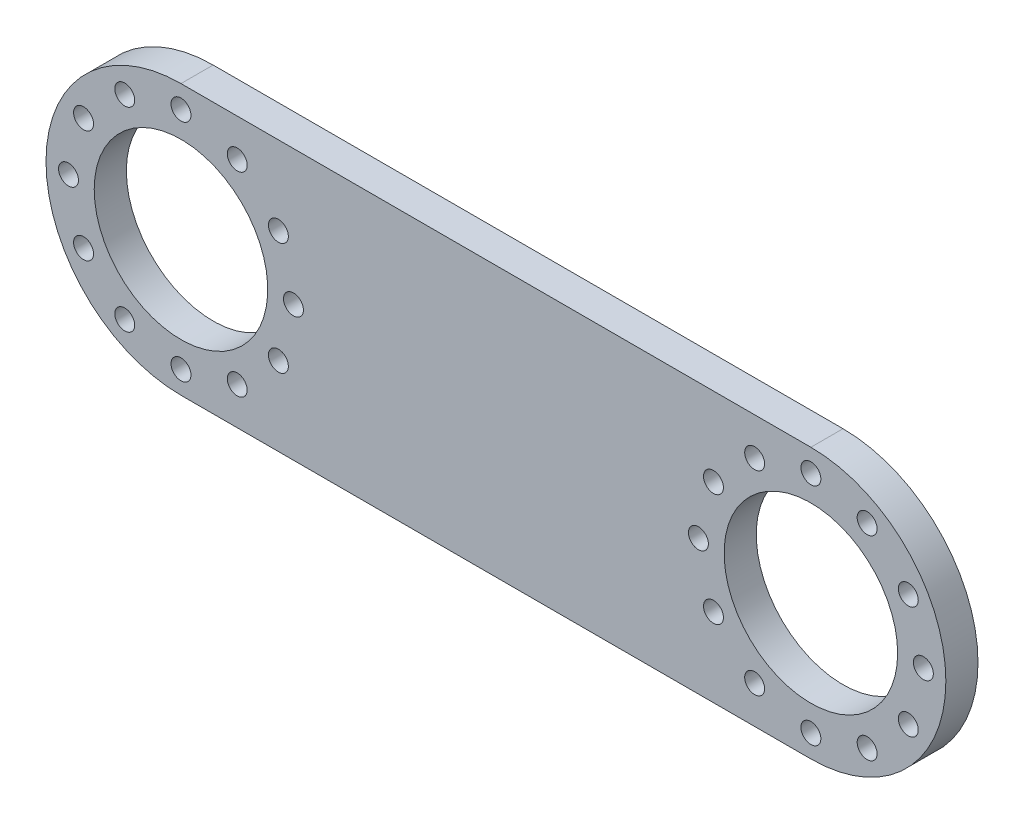
ISO-10303-21;
HEADER;
FILE_DESCRIPTION(('STEP AP214'),'2;1');
FILE_NAME('part.step','',(''),(''),'','','');
FILE_SCHEMA(('AUTOMOTIVE_DESIGN { 1 0 10303 214 1 1 1 1 }'));
ENDSEC;
DATA;
#1=APPLICATION_CONTEXT('core data for automotive mechanical design processes');
#2=APPLICATION_PROTOCOL_DEFINITION('international standard','automotive_design',2000,#1);
#3=PRODUCT_CONTEXT('',#1,'mechanical');
#4=PRODUCT('Part','Part','',(#3));
#5=PRODUCT_RELATED_PRODUCT_CATEGORY('part','',(#4));
#6=PRODUCT_DEFINITION_FORMATION('','',#4);
#7=PRODUCT_DEFINITION_CONTEXT('part definition',#1,'design');
#8=PRODUCT_DEFINITION('design','',#6,#7);
#9=PRODUCT_DEFINITION_SHAPE('','',#8);
#10=(LENGTH_UNIT() NAMED_UNIT(*) SI_UNIT(.MILLI.,.METRE.));
#11=(NAMED_UNIT(*) PLANE_ANGLE_UNIT() SI_UNIT($,.RADIAN.));
#12=(NAMED_UNIT(*) SI_UNIT($,.STERADIAN.) SOLID_ANGLE_UNIT());
#13=UNCERTAINTY_MEASURE_WITH_UNIT(LENGTH_MEASURE(1.E-05),#10,'distance_accuracy_value','');
#14=(GEOMETRIC_REPRESENTATION_CONTEXT(3) GLOBAL_UNCERTAINTY_ASSIGNED_CONTEXT((#13)) GLOBAL_UNIT_ASSIGNED_CONTEXT((#10,
#11,#12)) REPRESENTATION_CONTEXT('',''));
#15=CARTESIAN_POINT('',(0.,0.,0.));
#16=DIRECTION('',(0.,0.,1.));
#17=DIRECTION('',(1.,0.,0.));
#18=AXIS2_PLACEMENT_3D('',#15,#16,#17);
#19=CARTESIAN_POINT('',(-49.,0.,5.));
#20=DIRECTION('',(0.,0.,-1.));
#21=DIRECTION('',(-1.,0.,0.));
#22=AXIS2_PLACEMENT_3D('',#19,#20,#21);
#23=CYLINDRICAL_SURFACE('',#22,21.);
#24=CARTESIAN_POINT('',(-49.,0.,0.));
#25=DIRECTION('',(0.,0.,1.));
#26=DIRECTION('',(1.,0.,0.));
#27=AXIS2_PLACEMENT_3D('',#24,#25,#26);
#28=CIRCLE('',#27,21.);
#29=CARTESIAN_POINT('',(-49.,21.,0.));
#30=VERTEX_POINT('',#29);
#31=CARTESIAN_POINT('',(-49.,-21.,0.));
#32=VERTEX_POINT('',#31);
#33=EDGE_CURVE('E98',#30,#32,#28,.T.);
#34=ORIENTED_EDGE('',*,*,#33,.T.);
#35=DIRECTION('',(0.,0.,-1.));
#36=VECTOR('',#35,1.);
#37=CARTESIAN_POINT('',(-49.,-21.,5.));
#38=LINE('',#37,#36);
#39=CARTESIAN_POINT('',(-49.,-21.,5.));
#40=VERTEX_POINT('',#39);
#41=EDGE_CURVE('E11',#40,#32,#38,.T.);
#42=ORIENTED_EDGE('',*,*,#41,.F.);
#43=CARTESIAN_POINT('',(-49.,0.,5.));
#44=DIRECTION('',(0.,0.,1.));
#45=DIRECTION('',(1.,0.,0.));
#46=AXIS2_PLACEMENT_3D('',#43,#44,#45);
#47=CIRCLE('',#46,21.);
#48=CARTESIAN_POINT('',(-49.,21.,5.));
#49=VERTEX_POINT('',#48);
#50=EDGE_CURVE('E86',#49,#40,#47,.T.);
#51=ORIENTED_EDGE('',*,*,#50,.F.);
#52=DIRECTION('',(0.,0.,-1.));
#53=VECTOR('',#52,1.);
#54=CARTESIAN_POINT('',(-49.,21.,5.));
#55=LINE('',#54,#53);
#56=EDGE_CURVE('E94',#49,#30,#55,.T.);
#57=ORIENTED_EDGE('',*,*,#56,.T.);
#58=EDGE_LOOP('',(#34,#42,#51,#57));
#59=FACE_BOUND('',#58,.T.);
#60=ADVANCED_FACE('F35',(#59),#23,.T.);
#61=CARTESIAN_POINT('',(-49.,-21.,5.));
#62=DIRECTION('',(0.,1.,0.));
#63=DIRECTION('',(-1.,0.,0.));
#64=AXIS2_PLACEMENT_3D('',#61,#62,#63);
#65=PLANE('',#64);
#66=DIRECTION('',(1.,0.,0.));
#67=VECTOR('',#66,1.);
#68=CARTESIAN_POINT('',(-49.,-21.,0.));
#69=LINE('',#68,#67);
#70=CARTESIAN_POINT('',(49.,-21.,0.));
#71=VERTEX_POINT('',#70);
#72=EDGE_CURVE('E90',#32,#71,#69,.T.);
#73=ORIENTED_EDGE('',*,*,#72,.T.);
#74=DIRECTION('',(0.,0.,-1.));
#75=VECTOR('',#74,1.);
#76=CARTESIAN_POINT('',(49.,-21.,5.));
#77=LINE('',#76,#75);
#78=CARTESIAN_POINT('',(49.,-21.,5.));
#79=VERTEX_POINT('',#78);
#80=EDGE_CURVE('E43',#79,#71,#77,.T.);
#81=ORIENTED_EDGE('',*,*,#80,.F.);
#82=DIRECTION('',(1.,0.,0.));
#83=VECTOR('',#82,1.);
#84=CARTESIAN_POINT('',(-49.,-21.,5.));
#85=LINE('',#84,#83);
#86=EDGE_CURVE('E81',#40,#79,#85,.T.);
#87=ORIENTED_EDGE('',*,*,#86,.F.);
#88=ORIENTED_EDGE('',*,*,#41,.T.);
#89=EDGE_LOOP('',(#73,#81,#87,#88));
#90=FACE_BOUND('',#89,.T.);
#91=ADVANCED_FACE('F89',(#90),#65,.F.);
#92=CARTESIAN_POINT('',(49.,0.,5.));
#93=DIRECTION('',(0.,0.,-1.));
#94=DIRECTION('',(-1.,0.,0.));
#95=AXIS2_PLACEMENT_3D('',#92,#93,#94);
#96=CYLINDRICAL_SURFACE('',#95,21.);
#97=CARTESIAN_POINT('',(49.,0.,0.));
#98=DIRECTION('',(0.,0.,1.));
#99=DIRECTION('',(1.,0.,0.));
#100=AXIS2_PLACEMENT_3D('',#97,#98,#99);
#101=CIRCLE('',#100,21.);
#102=CARTESIAN_POINT('',(49.,21.,0.));
#103=VERTEX_POINT('',#102);
#104=EDGE_CURVE('E68',#71,#103,#101,.T.);
#105=ORIENTED_EDGE('',*,*,#104,.T.);
#106=DIRECTION('',(0.,0.,-1.));
#107=VECTOR('',#106,1.);
#108=CARTESIAN_POINT('',(49.,21.,5.));
#109=LINE('',#108,#107);
#110=CARTESIAN_POINT('',(49.,21.,5.));
#111=VERTEX_POINT('',#110);
#112=EDGE_CURVE('E91',#111,#103,#109,.T.);
#113=ORIENTED_EDGE('',*,*,#112,.F.);
#114=CARTESIAN_POINT('',(49.,0.,5.));
#115=DIRECTION('',(0.,0.,1.));
#116=DIRECTION('',(1.,0.,0.));
#117=AXIS2_PLACEMENT_3D('',#114,#115,#116);
#118=CIRCLE('',#117,21.);
#119=EDGE_CURVE('E84',#79,#111,#118,.T.);
#120=ORIENTED_EDGE('',*,*,#119,.F.);
#121=ORIENTED_EDGE('',*,*,#80,.T.);
#122=EDGE_LOOP('',(#105,#113,#120,#121));
#123=FACE_BOUND('',#122,.T.);
#124=ADVANCED_FACE('F92',(#123),#96,.T.);
#125=CARTESIAN_POINT('',(-49.,21.,5.));
#126=DIRECTION('',(0.,-1.,0.));
#127=DIRECTION('',(1.,0.,0.));
#128=AXIS2_PLACEMENT_3D('',#125,#126,#127);
#129=PLANE('',#128);
#130=DIRECTION('',(-1.,0.,0.));
#131=VECTOR('',#130,1.);
#132=CARTESIAN_POINT('',(-49.,21.,0.));
#133=LINE('',#132,#131);
#134=EDGE_CURVE('E74',#103,#30,#133,.T.);
#135=ORIENTED_EDGE('',*,*,#134,.T.);
#136=ORIENTED_EDGE('',*,*,#56,.F.);
#137=DIRECTION('',(-1.,0.,0.));
#138=VECTOR('',#137,1.);
#139=CARTESIAN_POINT('',(-49.,21.,5.));
#140=LINE('',#139,#138);
#141=EDGE_CURVE('E51',#111,#49,#140,.T.);
#142=ORIENTED_EDGE('',*,*,#141,.F.);
#143=ORIENTED_EDGE('',*,*,#112,.T.);
#144=EDGE_LOOP('',(#135,#136,#142,#143));
#145=FACE_BOUND('',#144,.T.);
#146=ADVANCED_FACE('F106',(#145),#129,.F.);
#147=CARTESIAN_POINT('',(-49.,0.,5.));
#148=DIRECTION('',(0.,0.,1.));
#149=DIRECTION('',(1.,0.,0.));
#150=AXIS2_PLACEMENT_3D('',#147,#148,#149);
#151=PLANE('',#150);
#152=CARTESIAN_POINT('',(-49.,17.5,5.));
#153=DIRECTION('',(0.,0.,-1.));
#154=DIRECTION('',(-1.,0.,0.));
#155=AXIS2_PLACEMENT_3D('',#152,#153,#154);
#156=CIRCLE('',#155,1.55);
#157=CARTESIAN_POINT('',(-50.55,17.5,5.));
#158=VERTEX_POINT('',#157);
#159=EDGE_CURVE('E239',#158,#158,#156,.T.);
#160=ORIENTED_EDGE('',*,*,#159,.T.);
#161=EDGE_LOOP('',(#160));
#162=FACE_BOUND('',#161,.T.);
#163=CARTESIAN_POINT('',(-57.75,15.1554445662277,5.));
#164=DIRECTION('',(0.,0.,-1.));
#165=DIRECTION('',(-1.,0.,0.));
#166=AXIS2_PLACEMENT_3D('',#163,#164,#165);
#167=CIRCLE('',#166,1.54999999999999);
#168=CARTESIAN_POINT('',(-59.3,15.1554445662277,5.));
#169=VERTEX_POINT('',#168);
#170=EDGE_CURVE('E233',#169,#169,#167,.T.);
#171=ORIENTED_EDGE('',*,*,#170,.T.);
#172=EDGE_LOOP('',(#171));
#173=FACE_BOUND('',#172,.T.);
#174=CARTESIAN_POINT('',(-64.1554445662277,8.75000000000001,5.));
#175=DIRECTION('',(0.,0.,-1.));
#176=DIRECTION('',(-1.,0.,0.));
#177=AXIS2_PLACEMENT_3D('',#174,#175,#176);
#178=CIRCLE('',#177,1.55000000000001);
#179=CARTESIAN_POINT('',(-65.7054445662277,8.75000000000001,5.));
#180=VERTEX_POINT('',#179);
#181=EDGE_CURVE('E227',#180,#180,#178,.T.);
#182=ORIENTED_EDGE('',*,*,#181,.T.);
#183=EDGE_LOOP('',(#182));
#184=FACE_BOUND('',#183,.T.);
#185=CARTESIAN_POINT('',(-66.5,0.,5.));
#186=DIRECTION('',(0.,0.,-1.));
#187=DIRECTION('',(-1.,0.,0.));
#188=AXIS2_PLACEMENT_3D('',#185,#186,#187);
#189=CIRCLE('',#188,1.54999999999999);
#190=CARTESIAN_POINT('',(-68.05,0.,5.));
#191=VERTEX_POINT('',#190);
#192=EDGE_CURVE('E221',#191,#191,#189,.T.);
#193=ORIENTED_EDGE('',*,*,#192,.T.);
#194=EDGE_LOOP('',(#193));
#195=FACE_BOUND('',#194,.T.);
#196=CARTESIAN_POINT('',(-64.1554445662277,-8.75,5.));
#197=DIRECTION('',(0.,0.,-1.));
#198=DIRECTION('',(-1.,0.,0.));
#199=AXIS2_PLACEMENT_3D('',#196,#197,#198);
#200=CIRCLE('',#199,1.54999999999999);
#201=CARTESIAN_POINT('',(-65.7054445662277,-8.75,5.));
#202=VERTEX_POINT('',#201);
#203=EDGE_CURVE('E215',#202,#202,#200,.T.);
#204=ORIENTED_EDGE('',*,*,#203,.T.);
#205=EDGE_LOOP('',(#204));
#206=FACE_BOUND('',#205,.T.);
#207=CARTESIAN_POINT('',(-57.75,-15.1554445662277,5.));
#208=DIRECTION('',(0.,0.,-1.));
#209=DIRECTION('',(-1.,0.,0.));
#210=AXIS2_PLACEMENT_3D('',#207,#208,#209);
#211=CIRCLE('',#210,1.54999999999999);
#212=CARTESIAN_POINT('',(-59.3,-15.1554445662277,5.));
#213=VERTEX_POINT('',#212);
#214=EDGE_CURVE('E209',#213,#213,#211,.T.);
#215=ORIENTED_EDGE('',*,*,#214,.T.);
#216=EDGE_LOOP('',(#215));
#217=FACE_BOUND('',#216,.T.);
#218=CARTESIAN_POINT('',(-49.,-17.5,5.));
#219=DIRECTION('',(0.,0.,-1.));
#220=DIRECTION('',(-1.,0.,0.));
#221=AXIS2_PLACEMENT_3D('',#218,#219,#220);
#222=CIRCLE('',#221,1.54999999999999);
#223=CARTESIAN_POINT('',(-50.55,-17.5,5.));
#224=VERTEX_POINT('',#223);
#225=EDGE_CURVE('E203',#224,#224,#222,.T.);
#226=ORIENTED_EDGE('',*,*,#225,.T.);
#227=EDGE_LOOP('',(#226));
#228=FACE_BOUND('',#227,.T.);
#229=CARTESIAN_POINT('',(-40.25,-15.1554445662277,5.));
#230=DIRECTION('',(0.,0.,-1.));
#231=DIRECTION('',(-1.,0.,0.));
#232=AXIS2_PLACEMENT_3D('',#229,#230,#231);
#233=CIRCLE('',#232,1.55000000000001);
#234=CARTESIAN_POINT('',(-41.8,-15.1554445662277,5.));
#235=VERTEX_POINT('',#234);
#236=EDGE_CURVE('E196',#235,#235,#233,.T.);
#237=ORIENTED_EDGE('',*,*,#236,.T.);
#238=EDGE_LOOP('',(#237));
#239=FACE_BOUND('',#238,.T.);
#240=CARTESIAN_POINT('',(-33.8445554337723,-8.75000000000001,5.));
#241=DIRECTION('',(0.,0.,-1.));
#242=DIRECTION('',(-1.,0.,0.));
#243=AXIS2_PLACEMENT_3D('',#240,#241,#242);
#244=CIRCLE('',#243,1.55);
#245=CARTESIAN_POINT('',(-35.3945554337723,-8.75000000000001,5.));
#246=VERTEX_POINT('',#245);
#247=EDGE_CURVE('E262',#246,#246,#244,.T.);
#248=ORIENTED_EDGE('',*,*,#247,.T.);
#249=EDGE_LOOP('',(#248));
#250=FACE_BOUND('',#249,.T.);
#251=CARTESIAN_POINT('',(-31.5,0.,5.));
#252=DIRECTION('',(0.,0.,-1.));
#253=DIRECTION('',(-1.,0.,0.));
#254=AXIS2_PLACEMENT_3D('',#251,#252,#253);
#255=CIRCLE('',#254,1.55);
#256=CARTESIAN_POINT('',(-33.05,0.,5.));
#257=VERTEX_POINT('',#256);
#258=EDGE_CURVE('E256',#257,#257,#255,.T.);
#259=ORIENTED_EDGE('',*,*,#258,.T.);
#260=EDGE_LOOP('',(#259));
#261=FACE_BOUND('',#260,.T.);
#262=CARTESIAN_POINT('',(-33.8445554337723,8.74999999999999,5.));
#263=DIRECTION('',(0.,0.,-1.));
#264=DIRECTION('',(-1.,0.,0.));
#265=AXIS2_PLACEMENT_3D('',#262,#263,#264);
#266=CIRCLE('',#265,1.55);
#267=CARTESIAN_POINT('',(-35.3945554337723,8.74999999999999,5.));
#268=VERTEX_POINT('',#267);
#269=EDGE_CURVE('E250',#268,#268,#266,.T.);
#270=ORIENTED_EDGE('',*,*,#269,.T.);
#271=EDGE_LOOP('',(#270));
#272=FACE_BOUND('',#271,.T.);
#273=CARTESIAN_POINT('',(-40.25,15.1554445662277,5.));
#274=DIRECTION('',(0.,0.,-1.));
#275=DIRECTION('',(-1.,0.,0.));
#276=AXIS2_PLACEMENT_3D('',#273,#274,#275);
#277=CIRCLE('',#276,1.55);
#278=CARTESIAN_POINT('',(-41.8,15.1554445662277,5.));
#279=VERTEX_POINT('',#278);
#280=EDGE_CURVE('E244',#279,#279,#277,.T.);
#281=ORIENTED_EDGE('',*,*,#280,.T.);
#282=EDGE_LOOP('',(#281));
#283=FACE_BOUND('',#282,.T.);
#284=CARTESIAN_POINT('',(-49.,0.,5.));
#285=DIRECTION('',(0.,0.,-1.));
#286=DIRECTION('',(-1.,0.,0.));
#287=AXIS2_PLACEMENT_3D('',#284,#285,#286);
#288=CIRCLE('',#287,13.5);
#289=CARTESIAN_POINT('',(-62.5,0.,5.));
#290=VERTEX_POINT('',#289);
#291=EDGE_CURVE('E190',#290,#290,#288,.T.);
#292=ORIENTED_EDGE('',*,*,#291,.T.);
#293=EDGE_LOOP('',(#292));
#294=FACE_BOUND('',#293,.T.);
#295=CARTESIAN_POINT('',(49.,17.5,5.));
#296=DIRECTION('',(0.,0.,1.));
#297=DIRECTION('',(1.,0.,0.));
#298=AXIS2_PLACEMENT_3D('',#295,#296,#297);
#299=CIRCLE('',#298,1.55);
#300=CARTESIAN_POINT('',(50.55,17.5,5.));
#301=VERTEX_POINT('',#300);
#302=EDGE_CURVE('E161',#301,#301,#299,.T.);
#303=ORIENTED_EDGE('',*,*,#302,.F.);
#304=EDGE_LOOP('',(#303));
#305=FACE_BOUND('',#304,.T.);
#306=CARTESIAN_POINT('',(57.75,15.1554445662277,5.));
#307=DIRECTION('',(0.,0.,1.));
#308=DIRECTION('',(1.,0.,0.));
#309=AXIS2_PLACEMENT_3D('',#306,#307,#308);
#310=CIRCLE('',#309,1.54999999999999);
#311=CARTESIAN_POINT('',(59.3,15.1554445662277,5.));
#312=VERTEX_POINT('',#311);
#313=EDGE_CURVE('E155',#312,#312,#310,.T.);
#314=ORIENTED_EDGE('',*,*,#313,.F.);
#315=EDGE_LOOP('',(#314));
#316=FACE_BOUND('',#315,.T.);
#317=CARTESIAN_POINT('',(64.1554445662277,8.75000000000001,5.));
#318=DIRECTION('',(0.,0.,1.));
#319=DIRECTION('',(1.,0.,0.));
#320=AXIS2_PLACEMENT_3D('',#317,#318,#319);
#321=CIRCLE('',#320,1.55000000000001);
#322=CARTESIAN_POINT('',(65.7054445662277,8.75000000000001,5.));
#323=VERTEX_POINT('',#322);
#324=EDGE_CURVE('E149',#323,#323,#321,.T.);
#325=ORIENTED_EDGE('',*,*,#324,.F.);
#326=EDGE_LOOP('',(#325));
#327=FACE_BOUND('',#326,.T.);
#328=CARTESIAN_POINT('',(66.5,0.,5.));
#329=DIRECTION('',(0.,0.,1.));
#330=DIRECTION('',(1.,0.,0.));
#331=AXIS2_PLACEMENT_3D('',#328,#329,#330);
#332=CIRCLE('',#331,1.54999999999999);
#333=CARTESIAN_POINT('',(68.05,0.,5.));
#334=VERTEX_POINT('',#333);
#335=EDGE_CURVE('E143',#334,#334,#332,.T.);
#336=ORIENTED_EDGE('',*,*,#335,.F.);
#337=EDGE_LOOP('',(#336));
#338=FACE_BOUND('',#337,.T.);
#339=CARTESIAN_POINT('',(64.1554445662277,-8.75,5.));
#340=DIRECTION('',(0.,0.,1.));
#341=DIRECTION('',(1.,0.,0.));
#342=AXIS2_PLACEMENT_3D('',#339,#340,#341);
#343=CIRCLE('',#342,1.54999999999999);
#344=CARTESIAN_POINT('',(65.7054445662277,-8.75,5.));
#345=VERTEX_POINT('',#344);
#346=EDGE_CURVE('E137',#345,#345,#343,.T.);
#347=ORIENTED_EDGE('',*,*,#346,.F.);
#348=EDGE_LOOP('',(#347));
#349=FACE_BOUND('',#348,.T.);
#350=CARTESIAN_POINT('',(57.75,-15.1554445662277,5.));
#351=DIRECTION('',(0.,0.,1.));
#352=DIRECTION('',(1.,0.,0.));
#353=AXIS2_PLACEMENT_3D('',#350,#351,#352);
#354=CIRCLE('',#353,1.54999999999999);
#355=CARTESIAN_POINT('',(59.3,-15.1554445662277,5.));
#356=VERTEX_POINT('',#355);
#357=EDGE_CURVE('E131',#356,#356,#354,.T.);
#358=ORIENTED_EDGE('',*,*,#357,.F.);
#359=EDGE_LOOP('',(#358));
#360=FACE_BOUND('',#359,.T.);
#361=CARTESIAN_POINT('',(49.,-17.5,5.));
#362=DIRECTION('',(0.,0.,1.));
#363=DIRECTION('',(1.,0.,0.));
#364=AXIS2_PLACEMENT_3D('',#361,#362,#363);
#365=CIRCLE('',#364,1.54999999999999);
#366=CARTESIAN_POINT('',(50.55,-17.5,5.));
#367=VERTEX_POINT('',#366);
#368=EDGE_CURVE('E125',#367,#367,#365,.T.);
#369=ORIENTED_EDGE('',*,*,#368,.F.);
#370=EDGE_LOOP('',(#369));
#371=FACE_BOUND('',#370,.T.);
#372=CARTESIAN_POINT('',(40.25,-15.1554445662277,5.));
#373=DIRECTION('',(0.,0.,1.));
#374=DIRECTION('',(1.,0.,0.));
#375=AXIS2_PLACEMENT_3D('',#372,#373,#374);
#376=CIRCLE('',#375,1.55000000000001);
#377=CARTESIAN_POINT('',(41.8,-15.1554445662277,5.));
#378=VERTEX_POINT('',#377);
#379=EDGE_CURVE('E118',#378,#378,#376,.T.);
#380=ORIENTED_EDGE('',*,*,#379,.F.);
#381=EDGE_LOOP('',(#380));
#382=FACE_BOUND('',#381,.T.);
#383=CARTESIAN_POINT('',(33.8445554337723,-8.75000000000001,5.));
#384=DIRECTION('',(0.,0.,1.));
#385=DIRECTION('',(1.,0.,0.));
#386=AXIS2_PLACEMENT_3D('',#383,#384,#385);
#387=CIRCLE('',#386,1.55);
#388=CARTESIAN_POINT('',(35.3945554337723,-8.75000000000001,5.));
#389=VERTEX_POINT('',#388);
#390=EDGE_CURVE('E185',#389,#389,#387,.T.);
#391=ORIENTED_EDGE('',*,*,#390,.F.);
#392=EDGE_LOOP('',(#391));
#393=FACE_BOUND('',#392,.T.);
#394=CARTESIAN_POINT('',(31.5,0.,5.));
#395=DIRECTION('',(0.,0.,1.));
#396=DIRECTION('',(1.,0.,0.));
#397=AXIS2_PLACEMENT_3D('',#394,#395,#396);
#398=CIRCLE('',#397,1.55);
#399=CARTESIAN_POINT('',(33.05,0.,5.));
#400=VERTEX_POINT('',#399);
#401=EDGE_CURVE('E179',#400,#400,#398,.T.);
#402=ORIENTED_EDGE('',*,*,#401,.F.);
#403=EDGE_LOOP('',(#402));
#404=FACE_BOUND('',#403,.T.);
#405=CARTESIAN_POINT('',(33.8445554337723,8.74999999999999,5.));
#406=DIRECTION('',(0.,0.,1.));
#407=DIRECTION('',(1.,0.,0.));
#408=AXIS2_PLACEMENT_3D('',#405,#406,#407);
#409=CIRCLE('',#408,1.55);
#410=CARTESIAN_POINT('',(35.3945554337723,8.74999999999999,5.));
#411=VERTEX_POINT('',#410);
#412=EDGE_CURVE('E173',#411,#411,#409,.T.);
#413=ORIENTED_EDGE('',*,*,#412,.F.);
#414=EDGE_LOOP('',(#413));
#415=FACE_BOUND('',#414,.T.);
#416=CARTESIAN_POINT('',(40.25,15.1554445662277,5.));
#417=DIRECTION('',(0.,0.,1.));
#418=DIRECTION('',(1.,0.,0.));
#419=AXIS2_PLACEMENT_3D('',#416,#417,#418);
#420=CIRCLE('',#419,1.55);
#421=CARTESIAN_POINT('',(41.8,15.1554445662277,5.));
#422=VERTEX_POINT('',#421);
#423=EDGE_CURVE('E166',#422,#422,#420,.T.);
#424=ORIENTED_EDGE('',*,*,#423,.F.);
#425=EDGE_LOOP('',(#424));
#426=FACE_BOUND('',#425,.T.);
#427=CARTESIAN_POINT('',(49.,0.,5.));
#428=DIRECTION('',(0.,0.,1.));
#429=DIRECTION('',(1.,0.,0.));
#430=AXIS2_PLACEMENT_3D('',#427,#428,#429);
#431=CIRCLE('',#430,13.5);
#432=CARTESIAN_POINT('',(62.5,0.,5.));
#433=VERTEX_POINT('',#432);
#434=EDGE_CURVE('E112',#433,#433,#431,.T.);
#435=ORIENTED_EDGE('',*,*,#434,.F.);
#436=EDGE_LOOP('',(#435));
#437=FACE_BOUND('',#436,.T.);
#438=ORIENTED_EDGE('',*,*,#50,.T.);
#439=ORIENTED_EDGE('',*,*,#86,.T.);
#440=ORIENTED_EDGE('',*,*,#119,.T.);
#441=ORIENTED_EDGE('',*,*,#141,.T.);
#442=EDGE_LOOP('',(#438,#439,#440,#441));
#443=FACE_BOUND('',#442,.T.);
#444=ADVANCED_FACE('F82',(#162,#173,#184,#195,#206,#217,#228,#239,#250,#261,#272,#283,#294,#305,
#316,#327,#338,#349,#360,#371,#382,#393,#404,#415,#426,#437,#443),#151,.T.);
#445=CARTESIAN_POINT('',(-49.,0.,0.));
#446=DIRECTION('',(0.,0.,1.));
#447=DIRECTION('',(1.,0.,0.));
#448=AXIS2_PLACEMENT_3D('',#445,#446,#447);
#449=PLANE('',#448);
#450=CARTESIAN_POINT('',(-49.,17.5,0.));
#451=DIRECTION('',(0.,0.,-1.));
#452=DIRECTION('',(-1.,0.,0.));
#453=AXIS2_PLACEMENT_3D('',#450,#451,#452);
#454=CIRCLE('',#453,1.55);
#455=CARTESIAN_POINT('',(-50.55,17.5,0.));
#456=VERTEX_POINT('',#455);
#457=EDGE_CURVE('E193',#456,#456,#454,.T.);
#458=ORIENTED_EDGE('',*,*,#457,.F.);
#459=EDGE_LOOP('',(#458));
#460=FACE_BOUND('',#459,.T.);
#461=CARTESIAN_POINT('',(-57.75,15.1554445662277,0.));
#462=DIRECTION('',(0.,0.,-1.));
#463=DIRECTION('',(-1.,0.,0.));
#464=AXIS2_PLACEMENT_3D('',#461,#462,#463);
#465=CIRCLE('',#464,1.54999999999999);
#466=CARTESIAN_POINT('',(-59.3,15.1554445662277,0.));
#467=VERTEX_POINT('',#466);
#468=EDGE_CURVE('E236',#467,#467,#465,.T.);
#469=ORIENTED_EDGE('',*,*,#468,.F.);
#470=EDGE_LOOP('',(#469));
#471=FACE_BOUND('',#470,.T.);
#472=CARTESIAN_POINT('',(-64.1554445662277,8.75000000000001,0.));
#473=DIRECTION('',(0.,0.,-1.));
#474=DIRECTION('',(-1.,0.,0.));
#475=AXIS2_PLACEMENT_3D('',#472,#473,#474);
#476=CIRCLE('',#475,1.55000000000001);
#477=CARTESIAN_POINT('',(-65.7054445662277,8.75000000000001,0.));
#478=VERTEX_POINT('',#477);
#479=EDGE_CURVE('E230',#478,#478,#476,.T.);
#480=ORIENTED_EDGE('',*,*,#479,.F.);
#481=EDGE_LOOP('',(#480));
#482=FACE_BOUND('',#481,.T.);
#483=CARTESIAN_POINT('',(-66.5,0.,0.));
#484=DIRECTION('',(0.,0.,-1.));
#485=DIRECTION('',(-1.,0.,0.));
#486=AXIS2_PLACEMENT_3D('',#483,#484,#485);
#487=CIRCLE('',#486,1.54999999999999);
#488=CARTESIAN_POINT('',(-68.05,0.,0.));
#489=VERTEX_POINT('',#488);
#490=EDGE_CURVE('E224',#489,#489,#487,.T.);
#491=ORIENTED_EDGE('',*,*,#490,.F.);
#492=EDGE_LOOP('',(#491));
#493=FACE_BOUND('',#492,.T.);
#494=CARTESIAN_POINT('',(-64.1554445662277,-8.75,0.));
#495=DIRECTION('',(0.,0.,-1.));
#496=DIRECTION('',(-1.,0.,0.));
#497=AXIS2_PLACEMENT_3D('',#494,#495,#496);
#498=CIRCLE('',#497,1.54999999999999);
#499=CARTESIAN_POINT('',(-65.7054445662277,-8.75,0.));
#500=VERTEX_POINT('',#499);
#501=EDGE_CURVE('E218',#500,#500,#498,.T.);
#502=ORIENTED_EDGE('',*,*,#501,.F.);
#503=EDGE_LOOP('',(#502));
#504=FACE_BOUND('',#503,.T.);
#505=CARTESIAN_POINT('',(-57.75,-15.1554445662277,0.));
#506=DIRECTION('',(0.,0.,-1.));
#507=DIRECTION('',(-1.,0.,0.));
#508=AXIS2_PLACEMENT_3D('',#505,#506,#507);
#509=CIRCLE('',#508,1.54999999999999);
#510=CARTESIAN_POINT('',(-59.3,-15.1554445662277,0.));
#511=VERTEX_POINT('',#510);
#512=EDGE_CURVE('E212',#511,#511,#509,.T.);
#513=ORIENTED_EDGE('',*,*,#512,.F.);
#514=EDGE_LOOP('',(#513));
#515=FACE_BOUND('',#514,.T.);
#516=CARTESIAN_POINT('',(-49.,-17.5,0.));
#517=DIRECTION('',(0.,0.,-1.));
#518=DIRECTION('',(-1.,0.,0.));
#519=AXIS2_PLACEMENT_3D('',#516,#517,#518);
#520=CIRCLE('',#519,1.54999999999999);
#521=CARTESIAN_POINT('',(-50.55,-17.5,0.));
#522=VERTEX_POINT('',#521);
#523=EDGE_CURVE('E206',#522,#522,#520,.T.);
#524=ORIENTED_EDGE('',*,*,#523,.F.);
#525=EDGE_LOOP('',(#524));
#526=FACE_BOUND('',#525,.T.);
#527=CARTESIAN_POINT('',(-40.25,-15.1554445662277,0.));
#528=DIRECTION('',(0.,0.,-1.));
#529=DIRECTION('',(-1.,0.,0.));
#530=AXIS2_PLACEMENT_3D('',#527,#528,#529);
#531=CIRCLE('',#530,1.55000000000001);
#532=CARTESIAN_POINT('',(-41.8,-15.1554445662277,0.));
#533=VERTEX_POINT('',#532);
#534=EDGE_CURVE('E199',#533,#533,#531,.T.);
#535=ORIENTED_EDGE('',*,*,#534,.F.);
#536=EDGE_LOOP('',(#535));
#537=FACE_BOUND('',#536,.T.);
#538=CARTESIAN_POINT('',(-33.8445554337723,-8.75000000000001,0.));
#539=DIRECTION('',(0.,0.,-1.));
#540=DIRECTION('',(-1.,0.,0.));
#541=AXIS2_PLACEMENT_3D('',#538,#539,#540);
#542=CIRCLE('',#541,1.55);
#543=CARTESIAN_POINT('',(-35.3945554337723,-8.75000000000001,0.));
#544=VERTEX_POINT('',#543);
#545=EDGE_CURVE('E200',#544,#544,#542,.T.);
#546=ORIENTED_EDGE('',*,*,#545,.F.);
#547=EDGE_LOOP('',(#546));
#548=FACE_BOUND('',#547,.T.);
#549=CARTESIAN_POINT('',(-31.5,0.,0.));
#550=DIRECTION('',(0.,0.,-1.));
#551=DIRECTION('',(-1.,0.,0.));
#552=AXIS2_PLACEMENT_3D('',#549,#550,#551);
#553=CIRCLE('',#552,1.55);
#554=CARTESIAN_POINT('',(-33.05,0.,0.));
#555=VERTEX_POINT('',#554);
#556=EDGE_CURVE('E259',#555,#555,#553,.T.);
#557=ORIENTED_EDGE('',*,*,#556,.F.);
#558=EDGE_LOOP('',(#557));
#559=FACE_BOUND('',#558,.T.);
#560=CARTESIAN_POINT('',(-33.8445554337723,8.74999999999999,0.));
#561=DIRECTION('',(0.,0.,-1.));
#562=DIRECTION('',(-1.,0.,0.));
#563=AXIS2_PLACEMENT_3D('',#560,#561,#562);
#564=CIRCLE('',#563,1.55);
#565=CARTESIAN_POINT('',(-35.3945554337723,8.74999999999999,0.));
#566=VERTEX_POINT('',#565);
#567=EDGE_CURVE('E253',#566,#566,#564,.T.);
#568=ORIENTED_EDGE('',*,*,#567,.F.);
#569=EDGE_LOOP('',(#568));
#570=FACE_BOUND('',#569,.T.);
#571=CARTESIAN_POINT('',(-40.25,15.1554445662277,0.));
#572=DIRECTION('',(0.,0.,-1.));
#573=DIRECTION('',(-1.,0.,0.));
#574=AXIS2_PLACEMENT_3D('',#571,#572,#573);
#575=CIRCLE('',#574,1.55);
#576=CARTESIAN_POINT('',(-41.8,15.1554445662277,0.));
#577=VERTEX_POINT('',#576);
#578=EDGE_CURVE('E247',#577,#577,#575,.T.);
#579=ORIENTED_EDGE('',*,*,#578,.F.);
#580=EDGE_LOOP('',(#579));
#581=FACE_BOUND('',#580,.T.);
#582=CARTESIAN_POINT('',(-49.,0.,0.));
#583=DIRECTION('',(0.,0.,-1.));
#584=DIRECTION('',(-1.,0.,0.));
#585=AXIS2_PLACEMENT_3D('',#582,#583,#584);
#586=CIRCLE('',#585,13.5);
#587=CARTESIAN_POINT('',(-62.5,0.,0.));
#588=VERTEX_POINT('',#587);
#589=EDGE_CURVE('E170',#588,#588,#586,.T.);
#590=ORIENTED_EDGE('',*,*,#589,.F.);
#591=EDGE_LOOP('',(#590));
#592=FACE_BOUND('',#591,.T.);
#593=CARTESIAN_POINT('',(49.,17.5,0.));
#594=DIRECTION('',(0.,0.,1.));
#595=DIRECTION('',(1.,0.,0.));
#596=AXIS2_PLACEMENT_3D('',#593,#594,#595);
#597=CIRCLE('',#596,1.55);
#598=CARTESIAN_POINT('',(50.55,17.5,0.));
#599=VERTEX_POINT('',#598);
#600=EDGE_CURVE('E115',#599,#599,#597,.T.);
#601=ORIENTED_EDGE('',*,*,#600,.T.);
#602=EDGE_LOOP('',(#601));
#603=FACE_BOUND('',#602,.T.);
#604=CARTESIAN_POINT('',(57.75,15.1554445662277,0.));
#605=DIRECTION('',(0.,0.,1.));
#606=DIRECTION('',(1.,0.,0.));
#607=AXIS2_PLACEMENT_3D('',#604,#605,#606);
#608=CIRCLE('',#607,1.54999999999999);
#609=CARTESIAN_POINT('',(59.3,15.1554445662277,0.));
#610=VERTEX_POINT('',#609);
#611=EDGE_CURVE('E158',#610,#610,#608,.T.);
#612=ORIENTED_EDGE('',*,*,#611,.T.);
#613=EDGE_LOOP('',(#612));
#614=FACE_BOUND('',#613,.T.);
#615=CARTESIAN_POINT('',(64.1554445662277,8.75000000000001,0.));
#616=DIRECTION('',(0.,0.,1.));
#617=DIRECTION('',(1.,0.,0.));
#618=AXIS2_PLACEMENT_3D('',#615,#616,#617);
#619=CIRCLE('',#618,1.55000000000001);
#620=CARTESIAN_POINT('',(65.7054445662277,8.75000000000001,0.));
#621=VERTEX_POINT('',#620);
#622=EDGE_CURVE('E152',#621,#621,#619,.T.);
#623=ORIENTED_EDGE('',*,*,#622,.T.);
#624=EDGE_LOOP('',(#623));
#625=FACE_BOUND('',#624,.T.);
#626=CARTESIAN_POINT('',(66.5,0.,0.));
#627=DIRECTION('',(0.,0.,1.));
#628=DIRECTION('',(1.,0.,0.));
#629=AXIS2_PLACEMENT_3D('',#626,#627,#628);
#630=CIRCLE('',#629,1.54999999999999);
#631=CARTESIAN_POINT('',(68.05,0.,0.));
#632=VERTEX_POINT('',#631);
#633=EDGE_CURVE('E146',#632,#632,#630,.T.);
#634=ORIENTED_EDGE('',*,*,#633,.T.);
#635=EDGE_LOOP('',(#634));
#636=FACE_BOUND('',#635,.T.);
#637=CARTESIAN_POINT('',(64.1554445662277,-8.75,0.));
#638=DIRECTION('',(0.,0.,1.));
#639=DIRECTION('',(1.,0.,0.));
#640=AXIS2_PLACEMENT_3D('',#637,#638,#639);
#641=CIRCLE('',#640,1.54999999999999);
#642=CARTESIAN_POINT('',(65.7054445662277,-8.75,0.));
#643=VERTEX_POINT('',#642);
#644=EDGE_CURVE('E140',#643,#643,#641,.T.);
#645=ORIENTED_EDGE('',*,*,#644,.T.);
#646=EDGE_LOOP('',(#645));
#647=FACE_BOUND('',#646,.T.);
#648=CARTESIAN_POINT('',(57.75,-15.1554445662277,0.));
#649=DIRECTION('',(0.,0.,1.));
#650=DIRECTION('',(1.,0.,0.));
#651=AXIS2_PLACEMENT_3D('',#648,#649,#650);
#652=CIRCLE('',#651,1.54999999999999);
#653=CARTESIAN_POINT('',(59.3,-15.1554445662277,0.));
#654=VERTEX_POINT('',#653);
#655=EDGE_CURVE('E134',#654,#654,#652,.T.);
#656=ORIENTED_EDGE('',*,*,#655,.T.);
#657=EDGE_LOOP('',(#656));
#658=FACE_BOUND('',#657,.T.);
#659=CARTESIAN_POINT('',(49.,-17.5,0.));
#660=DIRECTION('',(0.,0.,1.));
#661=DIRECTION('',(1.,0.,0.));
#662=AXIS2_PLACEMENT_3D('',#659,#660,#661);
#663=CIRCLE('',#662,1.54999999999999);
#664=CARTESIAN_POINT('',(50.55,-17.5,0.));
#665=VERTEX_POINT('',#664);
#666=EDGE_CURVE('E128',#665,#665,#663,.T.);
#667=ORIENTED_EDGE('',*,*,#666,.T.);
#668=EDGE_LOOP('',(#667));
#669=FACE_BOUND('',#668,.T.);
#670=CARTESIAN_POINT('',(40.25,-15.1554445662277,0.));
#671=DIRECTION('',(0.,0.,1.));
#672=DIRECTION('',(1.,0.,0.));
#673=AXIS2_PLACEMENT_3D('',#670,#671,#672);
#674=CIRCLE('',#673,1.55000000000001);
#675=CARTESIAN_POINT('',(41.8,-15.1554445662277,0.));
#676=VERTEX_POINT('',#675);
#677=EDGE_CURVE('E121',#676,#676,#674,.T.);
#678=ORIENTED_EDGE('',*,*,#677,.T.);
#679=EDGE_LOOP('',(#678));
#680=FACE_BOUND('',#679,.T.);
#681=CARTESIAN_POINT('',(33.8445554337723,-8.75000000000001,0.));
#682=DIRECTION('',(0.,0.,1.));
#683=DIRECTION('',(1.,0.,0.));
#684=AXIS2_PLACEMENT_3D('',#681,#682,#683);
#685=CIRCLE('',#684,1.55);
#686=CARTESIAN_POINT('',(35.3945554337723,-8.75000000000001,0.));
#687=VERTEX_POINT('',#686);
#688=EDGE_CURVE('E122',#687,#687,#685,.T.);
#689=ORIENTED_EDGE('',*,*,#688,.T.);
#690=EDGE_LOOP('',(#689));
#691=FACE_BOUND('',#690,.T.);
#692=CARTESIAN_POINT('',(31.5,0.,0.));
#693=DIRECTION('',(0.,0.,1.));
#694=DIRECTION('',(1.,0.,0.));
#695=AXIS2_PLACEMENT_3D('',#692,#693,#694);
#696=CIRCLE('',#695,1.55);
#697=CARTESIAN_POINT('',(33.05,0.,0.));
#698=VERTEX_POINT('',#697);
#699=EDGE_CURVE('E182',#698,#698,#696,.T.);
#700=ORIENTED_EDGE('',*,*,#699,.T.);
#701=EDGE_LOOP('',(#700));
#702=FACE_BOUND('',#701,.T.);
#703=CARTESIAN_POINT('',(33.8445554337723,8.74999999999999,0.));
#704=DIRECTION('',(0.,0.,1.));
#705=DIRECTION('',(1.,0.,0.));
#706=AXIS2_PLACEMENT_3D('',#703,#704,#705);
#707=CIRCLE('',#706,1.55);
#708=CARTESIAN_POINT('',(35.3945554337723,8.74999999999999,0.));
#709=VERTEX_POINT('',#708);
#710=EDGE_CURVE('E176',#709,#709,#707,.T.);
#711=ORIENTED_EDGE('',*,*,#710,.T.);
#712=EDGE_LOOP('',(#711));
#713=FACE_BOUND('',#712,.T.);
#714=CARTESIAN_POINT('',(40.25,15.1554445662277,0.));
#715=DIRECTION('',(0.,0.,1.));
#716=DIRECTION('',(1.,0.,0.));
#717=AXIS2_PLACEMENT_3D('',#714,#715,#716);
#718=CIRCLE('',#717,1.55);
#719=CARTESIAN_POINT('',(41.8,15.1554445662277,0.));
#720=VERTEX_POINT('',#719);
#721=EDGE_CURVE('E169',#720,#720,#718,.T.);
#722=ORIENTED_EDGE('',*,*,#721,.T.);
#723=EDGE_LOOP('',(#722));
#724=FACE_BOUND('',#723,.T.);
#725=CARTESIAN_POINT('',(49.,0.,0.));
#726=DIRECTION('',(0.,0.,1.));
#727=DIRECTION('',(1.,0.,0.));
#728=AXIS2_PLACEMENT_3D('',#725,#726,#727);
#729=CIRCLE('',#728,13.5);
#730=CARTESIAN_POINT('',(62.5,0.,0.));
#731=VERTEX_POINT('',#730);
#732=EDGE_CURVE('E101',#731,#731,#729,.T.);
#733=ORIENTED_EDGE('',*,*,#732,.T.);
#734=EDGE_LOOP('',(#733));
#735=FACE_BOUND('',#734,.T.);
#736=ORIENTED_EDGE('',*,*,#33,.F.);
#737=ORIENTED_EDGE('',*,*,#134,.F.);
#738=ORIENTED_EDGE('',*,*,#104,.F.);
#739=ORIENTED_EDGE('',*,*,#72,.F.);
#740=EDGE_LOOP('',(#736,#737,#738,#739));
#741=FACE_BOUND('',#740,.T.);
#742=ADVANCED_FACE('F109',(#460,#471,#482,#493,#504,#515,#526,#537,#548,#559,#570,#581,#592,
#603,#614,#625,#636,#647,#658,#669,#680,#691,#702,#713,#724,#735,#741),#449,.F.);
#743=CARTESIAN_POINT('',(49.,0.,0.));
#744=DIRECTION('',(0.,0.,1.));
#745=DIRECTION('',(1.,0.,0.));
#746=AXIS2_PLACEMENT_3D('',#743,#744,#745);
#747=CYLINDRICAL_SURFACE('',#746,13.5);
#748=ORIENTED_EDGE('',*,*,#732,.F.);
#749=EDGE_LOOP('',(#748));
#750=FACE_BOUND('',#749,.T.);
#751=ORIENTED_EDGE('',*,*,#434,.T.);
#752=EDGE_LOOP('',(#751));
#753=FACE_BOUND('',#752,.T.);
#754=ADVANCED_FACE('F273',(#750,#753),#747,.F.);
#755=CARTESIAN_POINT('',(40.25,15.1554445662277,0.));
#756=DIRECTION('',(0.,0.,1.));
#757=DIRECTION('',(1.,0.,0.));
#758=AXIS2_PLACEMENT_3D('',#755,#756,#757);
#759=CYLINDRICAL_SURFACE('',#758,1.55);
#760=ORIENTED_EDGE('',*,*,#721,.F.);
#761=EDGE_LOOP('',(#760));
#762=FACE_BOUND('',#761,.T.);
#763=ORIENTED_EDGE('',*,*,#423,.T.);
#764=EDGE_LOOP('',(#763));
#765=FACE_BOUND('',#764,.T.);
#766=ADVANCED_FACE('F312',(#762,#765),#759,.F.);
#767=CARTESIAN_POINT('',(33.8445554337723,8.74999999999999,0.));
#768=DIRECTION('',(0.,0.,1.));
#769=DIRECTION('',(1.,0.,0.));
#770=AXIS2_PLACEMENT_3D('',#767,#768,#769);
#771=CYLINDRICAL_SURFACE('',#770,1.55);
#772=ORIENTED_EDGE('',*,*,#710,.F.);
#773=EDGE_LOOP('',(#772));
#774=FACE_BOUND('',#773,.T.);
#775=ORIENTED_EDGE('',*,*,#412,.T.);
#776=EDGE_LOOP('',(#775));
#777=FACE_BOUND('',#776,.T.);
#778=ADVANCED_FACE('F355',(#774,#777),#771,.F.);
#779=CARTESIAN_POINT('',(31.5,0.,0.));
#780=DIRECTION('',(0.,0.,1.));
#781=DIRECTION('',(1.,0.,0.));
#782=AXIS2_PLACEMENT_3D('',#779,#780,#781);
#783=CYLINDRICAL_SURFACE('',#782,1.55);
#784=ORIENTED_EDGE('',*,*,#699,.F.);
#785=EDGE_LOOP('',(#784));
#786=FACE_BOUND('',#785,.T.);
#787=ORIENTED_EDGE('',*,*,#401,.T.);
#788=EDGE_LOOP('',(#787));
#789=FACE_BOUND('',#788,.T.);
#790=ADVANCED_FACE('F365',(#786,#789),#783,.F.);
#791=CARTESIAN_POINT('',(33.8445554337723,-8.75000000000001,0.));
#792=DIRECTION('',(0.,0.,1.));
#793=DIRECTION('',(1.,0.,0.));
#794=AXIS2_PLACEMENT_3D('',#791,#792,#793);
#795=CYLINDRICAL_SURFACE('',#794,1.55);
#796=ORIENTED_EDGE('',*,*,#688,.F.);
#797=EDGE_LOOP('',(#796));
#798=FACE_BOUND('',#797,.T.);
#799=ORIENTED_EDGE('',*,*,#390,.T.);
#800=EDGE_LOOP('',(#799));
#801=FACE_BOUND('',#800,.T.);
#802=ADVANCED_FACE('F375',(#798,#801),#795,.F.);
#803=CARTESIAN_POINT('',(40.25,-15.1554445662277,0.));
#804=DIRECTION('',(0.,0.,1.));
#805=DIRECTION('',(1.,0.,0.));
#806=AXIS2_PLACEMENT_3D('',#803,#804,#805);
#807=CYLINDRICAL_SURFACE('',#806,1.55000000000001);
#808=ORIENTED_EDGE('',*,*,#677,.F.);
#809=EDGE_LOOP('',(#808));
#810=FACE_BOUND('',#809,.T.);
#811=ORIENTED_EDGE('',*,*,#379,.T.);
#812=EDGE_LOOP('',(#811));
#813=FACE_BOUND('',#812,.T.);
#814=ADVANCED_FACE('F385',(#810,#813),#807,.F.);
#815=CARTESIAN_POINT('',(49.,-17.5,0.));
#816=DIRECTION('',(0.,0.,1.));
#817=DIRECTION('',(1.,0.,0.));
#818=AXIS2_PLACEMENT_3D('',#815,#816,#817);
#819=CYLINDRICAL_SURFACE('',#818,1.54999999999999);
#820=ORIENTED_EDGE('',*,*,#666,.F.);
#821=EDGE_LOOP('',(#820));
#822=FACE_BOUND('',#821,.T.);
#823=ORIENTED_EDGE('',*,*,#368,.T.);
#824=EDGE_LOOP('',(#823));
#825=FACE_BOUND('',#824,.T.);
#826=ADVANCED_FACE('F395',(#822,#825),#819,.F.);
#827=CARTESIAN_POINT('',(57.75,-15.1554445662277,0.));
#828=DIRECTION('',(0.,0.,1.));
#829=DIRECTION('',(1.,0.,0.));
#830=AXIS2_PLACEMENT_3D('',#827,#828,#829);
#831=CYLINDRICAL_SURFACE('',#830,1.54999999999999);
#832=ORIENTED_EDGE('',*,*,#655,.F.);
#833=EDGE_LOOP('',(#832));
#834=FACE_BOUND('',#833,.T.);
#835=ORIENTED_EDGE('',*,*,#357,.T.);
#836=EDGE_LOOP('',(#835));
#837=FACE_BOUND('',#836,.T.);
#838=ADVANCED_FACE('F405',(#834,#837),#831,.F.);
#839=CARTESIAN_POINT('',(64.1554445662277,-8.75,0.));
#840=DIRECTION('',(0.,0.,1.));
#841=DIRECTION('',(1.,0.,0.));
#842=AXIS2_PLACEMENT_3D('',#839,#840,#841);
#843=CYLINDRICAL_SURFACE('',#842,1.54999999999999);
#844=ORIENTED_EDGE('',*,*,#644,.F.);
#845=EDGE_LOOP('',(#844));
#846=FACE_BOUND('',#845,.T.);
#847=ORIENTED_EDGE('',*,*,#346,.T.);
#848=EDGE_LOOP('',(#847));
#849=FACE_BOUND('',#848,.T.);
#850=ADVANCED_FACE('F415',(#846,#849),#843,.F.);
#851=CARTESIAN_POINT('',(66.5,0.,0.));
#852=DIRECTION('',(0.,0.,1.));
#853=DIRECTION('',(1.,0.,0.));
#854=AXIS2_PLACEMENT_3D('',#851,#852,#853);
#855=CYLINDRICAL_SURFACE('',#854,1.54999999999999);
#856=ORIENTED_EDGE('',*,*,#633,.F.);
#857=EDGE_LOOP('',(#856));
#858=FACE_BOUND('',#857,.T.);
#859=ORIENTED_EDGE('',*,*,#335,.T.);
#860=EDGE_LOOP('',(#859));
#861=FACE_BOUND('',#860,.T.);
#862=ADVANCED_FACE('F425',(#858,#861),#855,.F.);
#863=CARTESIAN_POINT('',(64.1554445662277,8.75000000000001,0.));
#864=DIRECTION('',(0.,0.,1.));
#865=DIRECTION('',(1.,0.,0.));
#866=AXIS2_PLACEMENT_3D('',#863,#864,#865);
#867=CYLINDRICAL_SURFACE('',#866,1.55000000000001);
#868=ORIENTED_EDGE('',*,*,#622,.F.);
#869=EDGE_LOOP('',(#868));
#870=FACE_BOUND('',#869,.T.);
#871=ORIENTED_EDGE('',*,*,#324,.T.);
#872=EDGE_LOOP('',(#871));
#873=FACE_BOUND('',#872,.T.);
#874=ADVANCED_FACE('F435',(#870,#873),#867,.F.);
#875=CARTESIAN_POINT('',(57.75,15.1554445662277,0.));
#876=DIRECTION('',(0.,0.,1.));
#877=DIRECTION('',(1.,0.,0.));
#878=AXIS2_PLACEMENT_3D('',#875,#876,#877);
#879=CYLINDRICAL_SURFACE('',#878,1.54999999999999);
#880=ORIENTED_EDGE('',*,*,#611,.F.);
#881=EDGE_LOOP('',(#880));
#882=FACE_BOUND('',#881,.T.);
#883=ORIENTED_EDGE('',*,*,#313,.T.);
#884=EDGE_LOOP('',(#883));
#885=FACE_BOUND('',#884,.T.);
#886=ADVANCED_FACE('F445',(#882,#885),#879,.F.);
#887=CARTESIAN_POINT('',(49.,17.5,0.));
#888=DIRECTION('',(0.,0.,1.));
#889=DIRECTION('',(1.,0.,0.));
#890=AXIS2_PLACEMENT_3D('',#887,#888,#889);
#891=CYLINDRICAL_SURFACE('',#890,1.55);
#892=ORIENTED_EDGE('',*,*,#600,.F.);
#893=EDGE_LOOP('',(#892));
#894=FACE_BOUND('',#893,.T.);
#895=ORIENTED_EDGE('',*,*,#302,.T.);
#896=EDGE_LOOP('',(#895));
#897=FACE_BOUND('',#896,.T.);
#898=ADVANCED_FACE('F455',(#894,#897),#891,.F.);
#899=CARTESIAN_POINT('',(-49.,0.,0.));
#900=DIRECTION('',(0.,0.,1.));
#901=DIRECTION('',(1.,0.,0.));
#902=AXIS2_PLACEMENT_3D('',#899,#900,#901);
#903=CYLINDRICAL_SURFACE('',#902,13.5);
#904=ORIENTED_EDGE('',*,*,#589,.T.);
#905=EDGE_LOOP('',(#904));
#906=FACE_BOUND('',#905,.T.);
#907=ORIENTED_EDGE('',*,*,#291,.F.);
#908=EDGE_LOOP('',(#907));
#909=FACE_BOUND('',#908,.T.);
#910=ADVANCED_FACE('F464',(#906,#909),#903,.F.);
#911=CARTESIAN_POINT('',(-40.25,15.1554445662277,0.));
#912=DIRECTION('',(0.,0.,1.));
#913=DIRECTION('',(1.,0.,0.));
#914=AXIS2_PLACEMENT_3D('',#911,#912,#913);
#915=CYLINDRICAL_SURFACE('',#914,1.55);
#916=ORIENTED_EDGE('',*,*,#578,.T.);
#917=EDGE_LOOP('',(#916));
#918=FACE_BOUND('',#917,.T.);
#919=ORIENTED_EDGE('',*,*,#280,.F.);
#920=EDGE_LOOP('',(#919));
#921=FACE_BOUND('',#920,.T.);
#922=ADVANCED_FACE('F483',(#918,#921),#915,.F.);
#923=CARTESIAN_POINT('',(-33.8445554337723,8.74999999999999,0.));
#924=DIRECTION('',(0.,0.,1.));
#925=DIRECTION('',(1.,0.,0.));
#926=AXIS2_PLACEMENT_3D('',#923,#924,#925);
#927=CYLINDRICAL_SURFACE('',#926,1.55);
#928=ORIENTED_EDGE('',*,*,#567,.T.);
#929=EDGE_LOOP('',(#928));
#930=FACE_BOUND('',#929,.T.);
#931=ORIENTED_EDGE('',*,*,#269,.F.);
#932=EDGE_LOOP('',(#931));
#933=FACE_BOUND('',#932,.T.);
#934=ADVANCED_FACE('F493',(#930,#933),#927,.F.);
#935=CARTESIAN_POINT('',(-31.5,0.,0.));
#936=DIRECTION('',(0.,0.,1.));
#937=DIRECTION('',(1.,0.,0.));
#938=AXIS2_PLACEMENT_3D('',#935,#936,#937);
#939=CYLINDRICAL_SURFACE('',#938,1.55);
#940=ORIENTED_EDGE('',*,*,#556,.T.);
#941=EDGE_LOOP('',(#940));
#942=FACE_BOUND('',#941,.T.);
#943=ORIENTED_EDGE('',*,*,#258,.F.);
#944=EDGE_LOOP('',(#943));
#945=FACE_BOUND('',#944,.T.);
#946=ADVANCED_FACE('F503',(#942,#945),#939,.F.);
#947=CARTESIAN_POINT('',(-33.8445554337723,-8.75000000000001,0.));
#948=DIRECTION('',(0.,0.,1.));
#949=DIRECTION('',(1.,0.,0.));
#950=AXIS2_PLACEMENT_3D('',#947,#948,#949);
#951=CYLINDRICAL_SURFACE('',#950,1.55);
#952=ORIENTED_EDGE('',*,*,#545,.T.);
#953=EDGE_LOOP('',(#952));
#954=FACE_BOUND('',#953,.T.);
#955=ORIENTED_EDGE('',*,*,#247,.F.);
#956=EDGE_LOOP('',(#955));
#957=FACE_BOUND('',#956,.T.);
#958=ADVANCED_FACE('F268',(#954,#957),#951,.F.);
#959=CARTESIAN_POINT('',(-40.25,-15.1554445662277,0.));
#960=DIRECTION('',(0.,0.,1.));
#961=DIRECTION('',(1.,0.,0.));
#962=AXIS2_PLACEMENT_3D('',#959,#960,#961);
#963=CYLINDRICAL_SURFACE('',#962,1.55000000000001);
#964=ORIENTED_EDGE('',*,*,#534,.T.);
#965=EDGE_LOOP('',(#964));
#966=FACE_BOUND('',#965,.T.);
#967=ORIENTED_EDGE('',*,*,#236,.F.);
#968=EDGE_LOOP('',(#967));
#969=FACE_BOUND('',#968,.T.);
#970=ADVANCED_FACE('F522',(#966,#969),#963,.F.);
#971=CARTESIAN_POINT('',(-49.,-17.5,0.));
#972=DIRECTION('',(0.,0.,1.));
#973=DIRECTION('',(1.,0.,0.));
#974=AXIS2_PLACEMENT_3D('',#971,#972,#973);
#975=CYLINDRICAL_SURFACE('',#974,1.54999999999999);
#976=ORIENTED_EDGE('',*,*,#523,.T.);
#977=EDGE_LOOP('',(#976));
#978=FACE_BOUND('',#977,.T.);
#979=ORIENTED_EDGE('',*,*,#225,.F.);
#980=EDGE_LOOP('',(#979));
#981=FACE_BOUND('',#980,.T.);
#982=ADVANCED_FACE('F531',(#978,#981),#975,.F.);
#983=CARTESIAN_POINT('',(-57.75,-15.1554445662277,0.));
#984=DIRECTION('',(0.,0.,1.));
#985=DIRECTION('',(1.,0.,0.));
#986=AXIS2_PLACEMENT_3D('',#983,#984,#985);
#987=CYLINDRICAL_SURFACE('',#986,1.54999999999999);
#988=ORIENTED_EDGE('',*,*,#512,.T.);
#989=EDGE_LOOP('',(#988));
#990=FACE_BOUND('',#989,.T.);
#991=ORIENTED_EDGE('',*,*,#214,.F.);
#992=EDGE_LOOP('',(#991));
#993=FACE_BOUND('',#992,.T.);
#994=ADVANCED_FACE('F541',(#990,#993),#987,.F.);
#995=CARTESIAN_POINT('',(-64.1554445662277,-8.75,0.));
#996=DIRECTION('',(0.,0.,1.));
#997=DIRECTION('',(1.,0.,0.));
#998=AXIS2_PLACEMENT_3D('',#995,#996,#997);
#999=CYLINDRICAL_SURFACE('',#998,1.54999999999999);
#1000=ORIENTED_EDGE('',*,*,#501,.T.);
#1001=EDGE_LOOP('',(#1000));
#1002=FACE_BOUND('',#1001,.T.);
#1003=ORIENTED_EDGE('',*,*,#203,.F.);
#1004=EDGE_LOOP('',(#1003));
#1005=FACE_BOUND('',#1004,.T.);
#1006=ADVANCED_FACE('F551',(#1002,#1005),#999,.F.);
#1007=CARTESIAN_POINT('',(-66.5,0.,0.));
#1008=DIRECTION('',(0.,0.,1.));
#1009=DIRECTION('',(1.,0.,0.));
#1010=AXIS2_PLACEMENT_3D('',#1007,#1008,#1009);
#1011=CYLINDRICAL_SURFACE('',#1010,1.54999999999999);
#1012=ORIENTED_EDGE('',*,*,#490,.T.);
#1013=EDGE_LOOP('',(#1012));
#1014=FACE_BOUND('',#1013,.T.);
#1015=ORIENTED_EDGE('',*,*,#192,.F.);
#1016=EDGE_LOOP('',(#1015));
#1017=FACE_BOUND('',#1016,.T.);
#1018=ADVANCED_FACE('F561',(#1014,#1017),#1011,.F.);
#1019=CARTESIAN_POINT('',(-64.1554445662277,8.75000000000001,0.));
#1020=DIRECTION('',(0.,0.,1.));
#1021=DIRECTION('',(1.,0.,0.));
#1022=AXIS2_PLACEMENT_3D('',#1019,#1020,#1021);
#1023=CYLINDRICAL_SURFACE('',#1022,1.55000000000001);
#1024=ORIENTED_EDGE('',*,*,#479,.T.);
#1025=EDGE_LOOP('',(#1024));
#1026=FACE_BOUND('',#1025,.T.);
#1027=ORIENTED_EDGE('',*,*,#181,.F.);
#1028=EDGE_LOOP('',(#1027));
#1029=FACE_BOUND('',#1028,.T.);
#1030=ADVANCED_FACE('F571',(#1026,#1029),#1023,.F.);
#1031=CARTESIAN_POINT('',(-57.75,15.1554445662277,0.));
#1032=DIRECTION('',(0.,0.,1.));
#1033=DIRECTION('',(1.,0.,0.));
#1034=AXIS2_PLACEMENT_3D('',#1031,#1032,#1033);
#1035=CYLINDRICAL_SURFACE('',#1034,1.54999999999999);
#1036=ORIENTED_EDGE('',*,*,#468,.T.);
#1037=EDGE_LOOP('',(#1036));
#1038=FACE_BOUND('',#1037,.T.);
#1039=ORIENTED_EDGE('',*,*,#170,.F.);
#1040=EDGE_LOOP('',(#1039));
#1041=FACE_BOUND('',#1040,.T.);
#1042=ADVANCED_FACE('F581',(#1038,#1041),#1035,.F.);
#1043=CARTESIAN_POINT('',(-49.,17.5,0.));
#1044=DIRECTION('',(0.,0.,1.));
#1045=DIRECTION('',(1.,0.,0.));
#1046=AXIS2_PLACEMENT_3D('',#1043,#1044,#1045);
#1047=CYLINDRICAL_SURFACE('',#1046,1.55);
#1048=ORIENTED_EDGE('',*,*,#457,.T.);
#1049=EDGE_LOOP('',(#1048));
#1050=FACE_BOUND('',#1049,.T.);
#1051=ORIENTED_EDGE('',*,*,#159,.F.);
#1052=EDGE_LOOP('',(#1051));
#1053=FACE_BOUND('',#1052,.T.);
#1054=ADVANCED_FACE('F591',(#1050,#1053),#1047,.F.);
#1055=CLOSED_SHELL('',(#60,#91,#124,#146,#444,#742,#754,#766,#778,#790,#802,#814,#826,#838,#850,
#862,#874,#886,#898,#910,#922,#934,#946,#958,#970,#982,#994,#1006,#1018,#1030,#1042,#1054));
#1056=MANIFOLD_SOLID_BREP('B2',#1055);
#1057=ADVANCED_BREP_SHAPE_REPRESENTATION('',(#18,#1056),#14);
#1058=SHAPE_DEFINITION_REPRESENTATION(#9,#1057);
ENDSEC;
END-ISO-10303-21;
